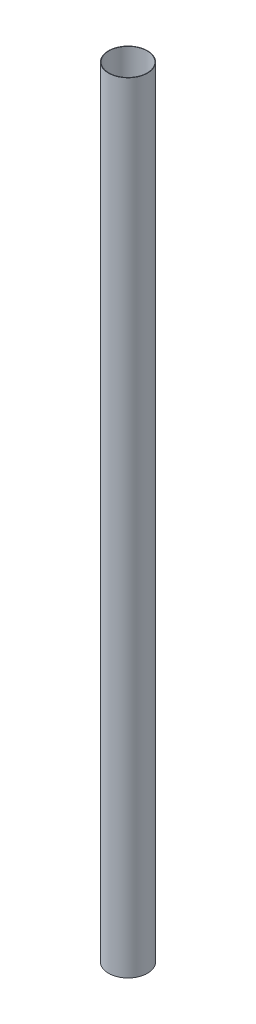
ISO-10303-21;
HEADER;
FILE_DESCRIPTION(('STEP AP214'),'2;1');
FILE_NAME('part.step','',(''),(''),'','','');
FILE_SCHEMA(('AUTOMOTIVE_DESIGN { 1 0 10303 214 1 1 1 1 }'));
ENDSEC;
DATA;
#1=APPLICATION_CONTEXT('core data for automotive mechanical design processes');
#2=APPLICATION_PROTOCOL_DEFINITION('international standard','automotive_design',2000,#1);
#3=PRODUCT_CONTEXT('',#1,'mechanical');
#4=PRODUCT('Part','Part','',(#3));
#5=PRODUCT_RELATED_PRODUCT_CATEGORY('part','',(#4));
#6=PRODUCT_DEFINITION_FORMATION('','',#4);
#7=PRODUCT_DEFINITION_CONTEXT('part definition',#1,'design');
#8=PRODUCT_DEFINITION('design','',#6,#7);
#9=PRODUCT_DEFINITION_SHAPE('','',#8);
#10=(LENGTH_UNIT() NAMED_UNIT(*) SI_UNIT(.MILLI.,.METRE.));
#11=(NAMED_UNIT(*) PLANE_ANGLE_UNIT() SI_UNIT($,.RADIAN.));
#12=(NAMED_UNIT(*) SI_UNIT($,.STERADIAN.) SOLID_ANGLE_UNIT());
#13=UNCERTAINTY_MEASURE_WITH_UNIT(LENGTH_MEASURE(1.E-05),#10,'distance_accuracy_value','');
#14=(GEOMETRIC_REPRESENTATION_CONTEXT(3) GLOBAL_UNCERTAINTY_ASSIGNED_CONTEXT((#13)) GLOBAL_UNIT_ASSIGNED_CONTEXT((#10,
#11,#12)) REPRESENTATION_CONTEXT('',''));
#15=CARTESIAN_POINT('',(0.,0.,0.));
#16=DIRECTION('',(0.,0.,1.));
#17=DIRECTION('',(1.,0.,0.));
#18=AXIS2_PLACEMENT_3D('',#15,#16,#17);
#19=CARTESIAN_POINT('',(0.,100.,0.));
#20=DIRECTION('',(0.,1.,0.));
#21=DIRECTION('',(0.,0.,1.));
#22=AXIS2_PLACEMENT_3D('',#19,#20,#21);
#23=PLANE('',#22);
#24=CARTESIAN_POINT('',(0.,100.,0.));
#25=DIRECTION('',(0.,1.,0.));
#26=DIRECTION('',(0.,0.,1.));
#27=AXIS2_PLACEMENT_3D('',#24,#25,#26);
#28=CIRCLE('',#27,2.5);
#29=CARTESIAN_POINT('',(0.,100.,2.5));
#30=VERTEX_POINT('',#29);
#31=EDGE_CURVE('E10',#30,#30,#28,.T.);
#32=ORIENTED_EDGE('',*,*,#31,.T.);
#33=EDGE_LOOP('',(#32));
#34=FACE_BOUND('',#33,.T.);
#35=CARTESIAN_POINT('',(0.,100.,0.));
#36=DIRECTION('',(0.,1.,0.));
#37=DIRECTION('',(0.,0.,1.));
#38=AXIS2_PLACEMENT_3D('',#35,#36,#37);
#39=CIRCLE('',#38,2.45);
#40=CARTESIAN_POINT('',(0.,100.,2.45));
#41=VERTEX_POINT('',#40);
#42=EDGE_CURVE('E43',#41,#41,#39,.T.);
#43=ORIENTED_EDGE('',*,*,#42,.F.);
#44=EDGE_LOOP('',(#43));
#45=FACE_BOUND('',#44,.T.);
#46=ADVANCED_FACE('F32',(#34,#45),#23,.T.);
#47=CARTESIAN_POINT('',(0.,0.,0.));
#48=DIRECTION('',(0.,1.,0.));
#49=DIRECTION('',(0.,0.,1.));
#50=AXIS2_PLACEMENT_3D('',#47,#48,#49);
#51=PLANE('',#50);
#52=CARTESIAN_POINT('',(0.,0.,0.));
#53=DIRECTION('',(0.,1.,0.));
#54=DIRECTION('',(0.,0.,1.));
#55=AXIS2_PLACEMENT_3D('',#52,#53,#54);
#56=CIRCLE('',#55,2.5);
#57=CARTESIAN_POINT('',(0.,0.,2.5));
#58=VERTEX_POINT('',#57);
#59=EDGE_CURVE('E36',#58,#58,#56,.T.);
#60=ORIENTED_EDGE('',*,*,#59,.F.);
#61=EDGE_LOOP('',(#60));
#62=FACE_BOUND('',#61,.T.);
#63=CARTESIAN_POINT('',(0.,0.,0.));
#64=DIRECTION('',(0.,1.,0.));
#65=DIRECTION('',(0.,0.,1.));
#66=AXIS2_PLACEMENT_3D('',#63,#64,#65);
#67=CIRCLE('',#66,2.45);
#68=CARTESIAN_POINT('',(0.,0.,2.45));
#69=VERTEX_POINT('',#68);
#70=EDGE_CURVE('E45',#69,#69,#67,.T.);
#71=ORIENTED_EDGE('',*,*,#70,.T.);
#72=EDGE_LOOP('',(#71));
#73=FACE_BOUND('',#72,.T.);
#74=ADVANCED_FACE('F55',(#62,#73),#51,.F.);
#75=CARTESIAN_POINT('',(0.,100.,0.));
#76=DIRECTION('',(0.,-1.,0.));
#77=DIRECTION('',(0.,0.,-1.));
#78=AXIS2_PLACEMENT_3D('',#75,#76,#77);
#79=CYLINDRICAL_SURFACE('',#78,2.5);
#80=ORIENTED_EDGE('',*,*,#31,.F.);
#81=EDGE_LOOP('',(#80));
#82=FACE_BOUND('',#81,.T.);
#83=ORIENTED_EDGE('',*,*,#59,.T.);
#84=EDGE_LOOP('',(#83));
#85=FACE_BOUND('',#84,.T.);
#86=ADVANCED_FACE('F34',(#82,#85),#79,.T.);
#87=CARTESIAN_POINT('',(0.,100.,0.));
#88=DIRECTION('',(0.,-1.,0.));
#89=DIRECTION('',(0.,0.,-1.));
#90=AXIS2_PLACEMENT_3D('',#87,#88,#89);
#91=CYLINDRICAL_SURFACE('',#90,2.45);
#92=ORIENTED_EDGE('',*,*,#42,.T.);
#93=EDGE_LOOP('',(#92));
#94=FACE_BOUND('',#93,.T.);
#95=ORIENTED_EDGE('',*,*,#70,.F.);
#96=EDGE_LOOP('',(#95));
#97=FACE_BOUND('',#96,.T.);
#98=ADVANCED_FACE('F51',(#94,#97),#91,.F.);
#99=CLOSED_SHELL('',(#46,#74,#86,#98));
#100=MANIFOLD_SOLID_BREP('B2',#99);
#101=ADVANCED_BREP_SHAPE_REPRESENTATION('',(#18,#100),#14);
#102=SHAPE_DEFINITION_REPRESENTATION(#9,#101);
ENDSEC;
END-ISO-10303-21;
